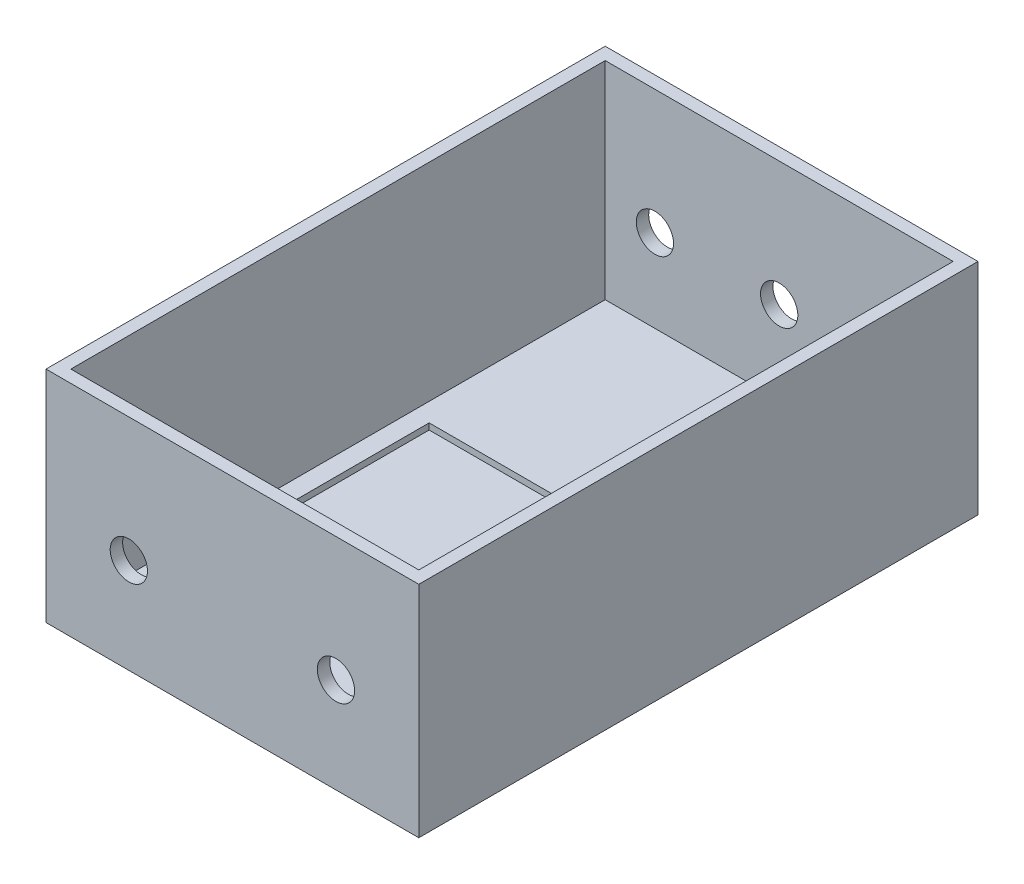
ISO-10303-21;
HEADER;
FILE_DESCRIPTION(('STEP AP214'),'2;1');
FILE_NAME('part.step','',(''),(''),'','','');
FILE_SCHEMA(('AUTOMOTIVE_DESIGN { 1 0 10303 214 1 1 1 1 }'));
ENDSEC;
DATA;
#1=APPLICATION_CONTEXT('core data for automotive mechanical design processes');
#2=APPLICATION_PROTOCOL_DEFINITION('international standard','automotive_design',2000,#1);
#3=PRODUCT_CONTEXT('',#1,'mechanical');
#4=PRODUCT('Part','Part','',(#3));
#5=PRODUCT_RELATED_PRODUCT_CATEGORY('part','',(#4));
#6=PRODUCT_DEFINITION_FORMATION('','',#4);
#7=PRODUCT_DEFINITION_CONTEXT('part definition',#1,'design');
#8=PRODUCT_DEFINITION('design','',#6,#7);
#9=PRODUCT_DEFINITION_SHAPE('','',#8);
#10=(LENGTH_UNIT() NAMED_UNIT(*) SI_UNIT(.MILLI.,.METRE.));
#11=(NAMED_UNIT(*) PLANE_ANGLE_UNIT() SI_UNIT($,.RADIAN.));
#12=(NAMED_UNIT(*) SI_UNIT($,.STERADIAN.) SOLID_ANGLE_UNIT());
#13=UNCERTAINTY_MEASURE_WITH_UNIT(LENGTH_MEASURE(1.E-05),#10,'distance_accuracy_value','');
#14=(GEOMETRIC_REPRESENTATION_CONTEXT(3) GLOBAL_UNCERTAINTY_ASSIGNED_CONTEXT((#13)) GLOBAL_UNIT_ASSIGNED_CONTEXT((#10,
#11,#12)) REPRESENTATION_CONTEXT('',''));
#15=CARTESIAN_POINT('',(0.,0.,0.));
#16=DIRECTION('',(0.,0.,1.));
#17=DIRECTION('',(1.,0.,0.));
#18=AXIS2_PLACEMENT_3D('',#15,#16,#17);
#19=CARTESIAN_POINT('',(0.,3.,0.));
#20=DIRECTION('',(0.,-1.,0.));
#21=DIRECTION('',(0.,0.,-1.));
#22=AXIS2_PLACEMENT_3D('',#19,#20,#21);
#23=PLANE('',#22);
#24=DIRECTION('',(0.,0.,-1.));
#25=VECTOR('',#24,1.);
#26=CARTESIAN_POINT('',(42.,3.,64.5));
#27=LINE('',#26,#25);
#28=CARTESIAN_POINT('',(42.,3.,64.5));
#29=VERTEX_POINT('',#28);
#30=CARTESIAN_POINT('',(42.,3.,-64.5));
#31=VERTEX_POINT('',#30);
#32=EDGE_CURVE('E144',#29,#31,#27,.T.);
#33=ORIENTED_EDGE('',*,*,#32,.T.);
#34=DIRECTION('',(-1.,0.,0.));
#35=VECTOR('',#34,1.);
#36=CARTESIAN_POINT('',(42.,3.,-64.5));
#37=LINE('',#36,#35);
#38=CARTESIAN_POINT('',(-42.,3.,-64.5));
#39=VERTEX_POINT('',#38);
#40=EDGE_CURVE('E168',#31,#39,#37,.T.);
#41=ORIENTED_EDGE('',*,*,#40,.T.);
#42=DIRECTION('',(0.,0.,1.));
#43=VECTOR('',#42,1.);
#44=CARTESIAN_POINT('',(-42.,3.,-64.5));
#45=LINE('',#44,#43);
#46=CARTESIAN_POINT('',(-42.,3.,64.5));
#47=VERTEX_POINT('',#46);
#48=EDGE_CURVE('E150',#39,#47,#45,.T.);
#49=ORIENTED_EDGE('',*,*,#48,.T.);
#50=DIRECTION('',(1.,0.,0.));
#51=VECTOR('',#50,1.);
#52=CARTESIAN_POINT('',(-42.,3.,64.5));
#53=LINE('',#52,#51);
#54=EDGE_CURVE('E174',#47,#29,#53,.T.);
#55=ORIENTED_EDGE('',*,*,#54,.T.);
#56=EDGE_LOOP('',(#33,#41,#49,#55));
#57=FACE_BOUND('',#56,.T.);
#58=DIRECTION('',(-1.,0.,0.));
#59=VECTOR('',#58,1.);
#60=CARTESIAN_POINT('',(-37.5,3.,-17.5));
#61=LINE('',#60,#59);
#62=CARTESIAN_POINT('',(37.5,3.,-17.5));
#63=VERTEX_POINT('',#62);
#64=CARTESIAN_POINT('',(-37.5,3.,-17.5));
#65=VERTEX_POINT('',#64);
#66=EDGE_CURVE('E223',#63,#65,#61,.T.);
#67=ORIENTED_EDGE('',*,*,#66,.F.);
#68=DIRECTION('',(0.,0.,-1.));
#69=VECTOR('',#68,1.);
#70=CARTESIAN_POINT('',(37.5,3.,17.5));
#71=LINE('',#70,#69);
#72=CARTESIAN_POINT('',(37.5,3.,17.5));
#73=VERTEX_POINT('',#72);
#74=EDGE_CURVE('E67',#73,#63,#71,.T.);
#75=ORIENTED_EDGE('',*,*,#74,.F.);
#76=DIRECTION('',(1.,0.,0.));
#77=VECTOR('',#76,1.);
#78=CARTESIAN_POINT('',(-37.5,3.,17.5));
#79=LINE('',#78,#77);
#80=CARTESIAN_POINT('',(-37.5,3.,17.5));
#81=VERTEX_POINT('',#80);
#82=EDGE_CURVE('E208',#81,#73,#79,.T.);
#83=ORIENTED_EDGE('',*,*,#82,.F.);
#84=DIRECTION('',(0.,0.,1.));
#85=VECTOR('',#84,1.);
#86=CARTESIAN_POINT('',(-37.5,3.,17.5));
#87=LINE('',#86,#85);
#88=EDGE_CURVE('E227',#65,#81,#87,.T.);
#89=ORIENTED_EDGE('',*,*,#88,.F.);
#90=EDGE_LOOP('',(#67,#75,#83,#89));
#91=FACE_BOUND('',#90,.T.);
#92=ADVANCED_FACE('F43',(#57,#91),#23,.F.);
#93=CARTESIAN_POINT('',(37.5,1.5,17.5));
#94=DIRECTION('',(1.,0.,0.));
#95=DIRECTION('',(0.,0.,-1.));
#96=AXIS2_PLACEMENT_3D('',#93,#94,#95);
#97=PLANE('',#96);
#98=ORIENTED_EDGE('',*,*,#74,.T.);
#99=DIRECTION('',(0.,1.,0.));
#100=VECTOR('',#99,1.);
#101=CARTESIAN_POINT('',(37.5,1.5,-17.5));
#102=LINE('',#101,#100);
#103=CARTESIAN_POINT('',(37.5,1.5,-17.5));
#104=VERTEX_POINT('',#103);
#105=EDGE_CURVE('E220',#104,#63,#102,.T.);
#106=ORIENTED_EDGE('',*,*,#105,.F.);
#107=DIRECTION('',(0.,0.,-1.));
#108=VECTOR('',#107,1.);
#109=CARTESIAN_POINT('',(37.5,1.5,17.5));
#110=LINE('',#109,#108);
#111=CARTESIAN_POINT('',(37.5,1.5,17.5));
#112=VERTEX_POINT('',#111);
#113=EDGE_CURVE('E203',#112,#104,#110,.T.);
#114=ORIENTED_EDGE('',*,*,#113,.F.);
#115=DIRECTION('',(0.,1.,0.));
#116=VECTOR('',#115,1.);
#117=CARTESIAN_POINT('',(37.5,1.5,17.5));
#118=LINE('',#117,#116);
#119=EDGE_CURVE('E234',#112,#73,#118,.T.);
#120=ORIENTED_EDGE('',*,*,#119,.T.);
#121=EDGE_LOOP('',(#98,#106,#114,#120));
#122=FACE_BOUND('',#121,.T.);
#123=ADVANCED_FACE('F298',(#122),#97,.F.);
#124=CARTESIAN_POINT('',(-37.5,1.5,17.5));
#125=DIRECTION('',(0.,0.,1.));
#126=DIRECTION('',(1.,0.,0.));
#127=AXIS2_PLACEMENT_3D('',#124,#125,#126);
#128=PLANE('',#127);
#129=ORIENTED_EDGE('',*,*,#82,.T.);
#130=ORIENTED_EDGE('',*,*,#119,.F.);
#131=DIRECTION('',(1.,0.,0.));
#132=VECTOR('',#131,1.);
#133=CARTESIAN_POINT('',(-37.5,1.5,17.5));
#134=LINE('',#133,#132);
#135=CARTESIAN_POINT('',(-37.5,1.5,17.5));
#136=VERTEX_POINT('',#135);
#137=EDGE_CURVE('E216',#136,#112,#134,.T.);
#138=ORIENTED_EDGE('',*,*,#137,.F.);
#139=DIRECTION('',(0.,1.,0.));
#140=VECTOR('',#139,1.);
#141=CARTESIAN_POINT('',(-37.5,1.5,17.5));
#142=LINE('',#141,#140);
#143=EDGE_CURVE('E238',#136,#81,#142,.T.);
#144=ORIENTED_EDGE('',*,*,#143,.T.);
#145=EDGE_LOOP('',(#129,#130,#138,#144));
#146=FACE_BOUND('',#145,.T.);
#147=ADVANCED_FACE('F306',(#146),#128,.F.);
#148=CARTESIAN_POINT('',(-37.5,1.5,17.5));
#149=DIRECTION('',(-1.,0.,0.));
#150=DIRECTION('',(0.,0.,1.));
#151=AXIS2_PLACEMENT_3D('',#148,#149,#150);
#152=PLANE('',#151);
#153=ORIENTED_EDGE('',*,*,#88,.T.);
#154=ORIENTED_EDGE('',*,*,#143,.F.);
#155=DIRECTION('',(0.,0.,1.));
#156=VECTOR('',#155,1.);
#157=CARTESIAN_POINT('',(-37.5,1.5,17.5));
#158=LINE('',#157,#156);
#159=CARTESIAN_POINT('',(-37.5,1.5,-17.5));
#160=VERTEX_POINT('',#159);
#161=EDGE_CURVE('E212',#160,#136,#158,.T.);
#162=ORIENTED_EDGE('',*,*,#161,.F.);
#163=DIRECTION('',(0.,1.,0.));
#164=VECTOR('',#163,1.);
#165=CARTESIAN_POINT('',(-37.5,1.5,-17.5));
#166=LINE('',#165,#164);
#167=EDGE_CURVE('E241',#160,#65,#166,.T.);
#168=ORIENTED_EDGE('',*,*,#167,.T.);
#169=EDGE_LOOP('',(#153,#154,#162,#168));
#170=FACE_BOUND('',#169,.T.);
#171=ADVANCED_FACE('F402',(#170),#152,.F.);
#172=CARTESIAN_POINT('',(-37.5,1.5,-17.5));
#173=DIRECTION('',(0.,0.,-1.));
#174=DIRECTION('',(-1.,0.,0.));
#175=AXIS2_PLACEMENT_3D('',#172,#173,#174);
#176=PLANE('',#175);
#177=ORIENTED_EDGE('',*,*,#66,.T.);
#178=ORIENTED_EDGE('',*,*,#167,.F.);
#179=DIRECTION('',(-1.,0.,0.));
#180=VECTOR('',#179,1.);
#181=CARTESIAN_POINT('',(-37.5,1.5,-17.5));
#182=LINE('',#181,#180);
#183=EDGE_CURVE('E207',#104,#160,#182,.T.);
#184=ORIENTED_EDGE('',*,*,#183,.F.);
#185=ORIENTED_EDGE('',*,*,#105,.T.);
#186=EDGE_LOOP('',(#177,#178,#184,#185));
#187=FACE_BOUND('',#186,.T.);
#188=ADVANCED_FACE('F398',(#187),#176,.F.);
#189=CARTESIAN_POINT('',(0.,1.5,0.));
#190=DIRECTION('',(0.,-1.,0.));
#191=DIRECTION('',(0.,0.,-1.));
#192=AXIS2_PLACEMENT_3D('',#189,#190,#191);
#193=PLANE('',#192);
#194=ORIENTED_EDGE('',*,*,#113,.T.);
#195=ORIENTED_EDGE('',*,*,#183,.T.);
#196=ORIENTED_EDGE('',*,*,#161,.T.);
#197=ORIENTED_EDGE('',*,*,#137,.T.);
#198=EDGE_LOOP('',(#194,#195,#196,#197));
#199=FACE_BOUND('',#198,.T.);
#200=ADVANCED_FACE('F395',(#199),#193,.F.);
#201=CARTESIAN_POINT('',(0.,53.,0.));
#202=DIRECTION('',(0.,1.,0.));
#203=DIRECTION('',(0.,0.,1.));
#204=AXIS2_PLACEMENT_3D('',#201,#202,#203);
#205=PLANE('',#204);
#206=DIRECTION('',(-1.,0.,0.));
#207=VECTOR('',#206,1.);
#208=CARTESIAN_POINT('',(45.,53.,-67.5));
#209=LINE('',#208,#207);
#210=CARTESIAN_POINT('',(45.,53.,-67.5));
#211=VERTEX_POINT('',#210);
#212=CARTESIAN_POINT('',(-45.,53.,-67.5));
#213=VERTEX_POINT('',#212);
#214=EDGE_CURVE('E152',#211,#213,#209,.T.);
#215=ORIENTED_EDGE('',*,*,#214,.T.);
#216=DIRECTION('',(0.,0.,1.));
#217=VECTOR('',#216,1.);
#218=CARTESIAN_POINT('',(-45.,53.,-67.5));
#219=LINE('',#218,#217);
#220=CARTESIAN_POINT('',(-45.,53.,67.5));
#221=VERTEX_POINT('',#220);
#222=EDGE_CURVE('E191',#213,#221,#219,.T.);
#223=ORIENTED_EDGE('',*,*,#222,.T.);
#224=DIRECTION('',(1.,0.,0.));
#225=VECTOR('',#224,1.);
#226=CARTESIAN_POINT('',(-45.,53.,67.5));
#227=LINE('',#226,#225);
#228=CARTESIAN_POINT('',(45.,53.,67.5));
#229=VERTEX_POINT('',#228);
#230=EDGE_CURVE('E195',#221,#229,#227,.T.);
#231=ORIENTED_EDGE('',*,*,#230,.T.);
#232=DIRECTION('',(0.,0.,-1.));
#233=VECTOR('',#232,1.);
#234=CARTESIAN_POINT('',(45.,53.,67.5));
#235=LINE('',#234,#233);
#236=EDGE_CURVE('E199',#229,#211,#235,.T.);
#237=ORIENTED_EDGE('',*,*,#236,.T.);
#238=EDGE_LOOP('',(#215,#223,#231,#237));
#239=FACE_BOUND('',#238,.T.);
#240=DIRECTION('',(0.,0.,1.));
#241=VECTOR('',#240,1.);
#242=CARTESIAN_POINT('',(-42.,53.,-64.5));
#243=LINE('',#242,#241);
#244=CARTESIAN_POINT('',(-42.,53.,-64.5));
#245=VERTEX_POINT('',#244);
#246=CARTESIAN_POINT('',(-42.,53.,64.5));
#247=VERTEX_POINT('',#246);
#248=EDGE_CURVE('E143',#245,#247,#243,.T.);
#249=ORIENTED_EDGE('',*,*,#248,.F.);
#250=DIRECTION('',(-1.,0.,0.));
#251=VECTOR('',#250,1.);
#252=CARTESIAN_POINT('',(42.,53.,-64.5));
#253=LINE('',#252,#251);
#254=CARTESIAN_POINT('',(42.,53.,-64.5));
#255=VERTEX_POINT('',#254);
#256=EDGE_CURVE('E134',#255,#245,#253,.T.);
#257=ORIENTED_EDGE('',*,*,#256,.F.);
#258=DIRECTION('',(0.,0.,-1.));
#259=VECTOR('',#258,1.);
#260=CARTESIAN_POINT('',(42.,53.,64.5));
#261=LINE('',#260,#259);
#262=CARTESIAN_POINT('',(42.,53.,64.5));
#263=VERTEX_POINT('',#262);
#264=EDGE_CURVE('E162',#263,#255,#261,.T.);
#265=ORIENTED_EDGE('',*,*,#264,.F.);
#266=DIRECTION('',(1.,0.,0.));
#267=VECTOR('',#266,1.);
#268=CARTESIAN_POINT('',(-42.,53.,64.5));
#269=LINE('',#268,#267);
#270=EDGE_CURVE('E158',#247,#263,#269,.T.);
#271=ORIENTED_EDGE('',*,*,#270,.F.);
#272=EDGE_LOOP('',(#249,#257,#265,#271));
#273=FACE_BOUND('',#272,.T.);
#274=ADVANCED_FACE('F156',(#239,#273),#205,.T.);
#275=CARTESIAN_POINT('',(42.,53.,-64.5));
#276=DIRECTION('',(0.,0.,1.));
#277=DIRECTION('',(1.,0.,0.));
#278=AXIS2_PLACEMENT_3D('',#275,#276,#277);
#279=PLANE('',#278);
#280=CARTESIAN_POINT('',(30.,23.,-64.5));
#281=DIRECTION('',(0.,0.,-1.));
#282=DIRECTION('',(-1.,0.,0.));
#283=AXIS2_PLACEMENT_3D('',#280,#281,#282);
#284=CIRCLE('',#283,4.5);
#285=CARTESIAN_POINT('',(25.5,23.,-64.5));
#286=VERTEX_POINT('',#285);
#287=EDGE_CURVE('E334',#286,#286,#284,.T.);
#288=ORIENTED_EDGE('',*,*,#287,.T.);
#289=EDGE_LOOP('',(#288));
#290=FACE_BOUND('',#289,.T.);
#291=CARTESIAN_POINT('',(0.,23.,-64.5));
#292=DIRECTION('',(0.,0.,-1.));
#293=DIRECTION('',(-1.,0.,0.));
#294=AXIS2_PLACEMENT_3D('',#291,#292,#293);
#295=CIRCLE('',#294,4.5);
#296=CARTESIAN_POINT('',(-4.5,23.,-64.5));
#297=VERTEX_POINT('',#296);
#298=EDGE_CURVE('E347',#297,#297,#295,.T.);
#299=ORIENTED_EDGE('',*,*,#298,.T.);
#300=EDGE_LOOP('',(#299));
#301=FACE_BOUND('',#300,.T.);
#302=CARTESIAN_POINT('',(-30.,23.,-64.5));
#303=DIRECTION('',(0.,0.,-1.));
#304=DIRECTION('',(-1.,0.,0.));
#305=AXIS2_PLACEMENT_3D('',#302,#303,#304);
#306=CIRCLE('',#305,4.5);
#307=CARTESIAN_POINT('',(-34.5,23.,-64.5));
#308=VERTEX_POINT('',#307);
#309=EDGE_CURVE('E339',#308,#308,#306,.T.);
#310=ORIENTED_EDGE('',*,*,#309,.T.);
#311=EDGE_LOOP('',(#310));
#312=FACE_BOUND('',#311,.T.);
#313=ORIENTED_EDGE('',*,*,#40,.F.);
#314=DIRECTION('',(0.,-1.,0.));
#315=VECTOR('',#314,1.);
#316=CARTESIAN_POINT('',(42.,53.,-64.5));
#317=LINE('',#316,#315);
#318=EDGE_CURVE('E59',#255,#31,#317,.T.);
#319=ORIENTED_EDGE('',*,*,#318,.F.);
#320=ORIENTED_EDGE('',*,*,#256,.T.);
#321=DIRECTION('',(0.,-1.,0.));
#322=VECTOR('',#321,1.);
#323=CARTESIAN_POINT('',(-42.,53.,-64.5));
#324=LINE('',#323,#322);
#325=EDGE_CURVE('E137',#245,#39,#324,.T.);
#326=ORIENTED_EDGE('',*,*,#325,.T.);
#327=EDGE_LOOP('',(#313,#319,#320,#326));
#328=FACE_BOUND('',#327,.T.);
#329=ADVANCED_FACE('F136',(#290,#301,#312,#328),#279,.T.);
#330=CARTESIAN_POINT('',(-42.,53.,-64.5));
#331=DIRECTION('',(1.,0.,0.));
#332=DIRECTION('',(0.,0.,-1.));
#333=AXIS2_PLACEMENT_3D('',#330,#331,#332);
#334=PLANE('',#333);
#335=ORIENTED_EDGE('',*,*,#48,.F.);
#336=ORIENTED_EDGE('',*,*,#325,.F.);
#337=ORIENTED_EDGE('',*,*,#248,.T.);
#338=DIRECTION('',(0.,-1.,0.));
#339=VECTOR('',#338,1.);
#340=CARTESIAN_POINT('',(-42.,53.,64.5));
#341=LINE('',#340,#339);
#342=EDGE_CURVE('E153',#247,#47,#341,.T.);
#343=ORIENTED_EDGE('',*,*,#342,.T.);
#344=EDGE_LOOP('',(#335,#336,#337,#343));
#345=FACE_BOUND('',#344,.T.);
#346=ADVANCED_FACE('F147',(#345),#334,.T.);
#347=CARTESIAN_POINT('',(-42.,53.,64.5));
#348=DIRECTION('',(0.,0.,-1.));
#349=DIRECTION('',(-1.,0.,0.));
#350=AXIS2_PLACEMENT_3D('',#347,#348,#349);
#351=PLANE('',#350);
#352=CARTESIAN_POINT('',(-25.,23.,64.5));
#353=DIRECTION('',(0.,0.,1.));
#354=DIRECTION('',(1.,0.,0.));
#355=AXIS2_PLACEMENT_3D('',#352,#353,#354);
#356=CIRCLE('',#355,4.5);
#357=CARTESIAN_POINT('',(-20.5,23.,64.5));
#358=VERTEX_POINT('',#357);
#359=EDGE_CURVE('E171',#358,#358,#356,.T.);
#360=ORIENTED_EDGE('',*,*,#359,.T.);
#361=EDGE_LOOP('',(#360));
#362=FACE_BOUND('',#361,.T.);
#363=CARTESIAN_POINT('',(25.,23.,64.5));
#364=DIRECTION('',(0.,0.,1.));
#365=DIRECTION('',(1.,0.,0.));
#366=AXIS2_PLACEMENT_3D('',#363,#364,#365);
#367=CIRCLE('',#366,4.5);
#368=CARTESIAN_POINT('',(29.5,23.,64.5));
#369=VERTEX_POINT('',#368);
#370=EDGE_CURVE('E328',#369,#369,#367,.T.);
#371=ORIENTED_EDGE('',*,*,#370,.T.);
#372=EDGE_LOOP('',(#371));
#373=FACE_BOUND('',#372,.T.);
#374=ORIENTED_EDGE('',*,*,#54,.F.);
#375=ORIENTED_EDGE('',*,*,#342,.F.);
#376=ORIENTED_EDGE('',*,*,#270,.T.);
#377=DIRECTION('',(0.,-1.,0.));
#378=VECTOR('',#377,1.);
#379=CARTESIAN_POINT('',(42.,53.,64.5));
#380=LINE('',#379,#378);
#381=EDGE_CURVE('E183',#263,#29,#380,.T.);
#382=ORIENTED_EDGE('',*,*,#381,.T.);
#383=EDGE_LOOP('',(#374,#375,#376,#382));
#384=FACE_BOUND('',#383,.T.);
#385=ADVANCED_FACE('F385',(#362,#373,#384),#351,.T.);
#386=CARTESIAN_POINT('',(42.,53.,64.5));
#387=DIRECTION('',(-1.,0.,0.));
#388=DIRECTION('',(0.,0.,1.));
#389=AXIS2_PLACEMENT_3D('',#386,#387,#388);
#390=PLANE('',#389);
#391=ORIENTED_EDGE('',*,*,#32,.F.);
#392=ORIENTED_EDGE('',*,*,#381,.F.);
#393=ORIENTED_EDGE('',*,*,#264,.T.);
#394=ORIENTED_EDGE('',*,*,#318,.T.);
#395=EDGE_LOOP('',(#391,#392,#393,#394));
#396=FACE_BOUND('',#395,.T.);
#397=ADVANCED_FACE('F313',(#396),#390,.T.);
#398=CARTESIAN_POINT('',(0.,0.,0.));
#399=DIRECTION('',(0.,-1.,0.));
#400=DIRECTION('',(0.,0.,-1.));
#401=AXIS2_PLACEMENT_3D('',#398,#399,#400);
#402=PLANE('',#401);
#403=DIRECTION('',(0.,0.,-1.));
#404=VECTOR('',#403,1.);
#405=CARTESIAN_POINT('',(45.,0.,67.5));
#406=LINE('',#405,#404);
#407=CARTESIAN_POINT('',(45.,0.,67.5));
#408=VERTEX_POINT('',#407);
#409=CARTESIAN_POINT('',(45.,0.,-67.5));
#410=VERTEX_POINT('',#409);
#411=EDGE_CURVE('E237',#408,#410,#406,.T.);
#412=ORIENTED_EDGE('',*,*,#411,.F.);
#413=DIRECTION('',(1.,0.,0.));
#414=VECTOR('',#413,1.);
#415=CARTESIAN_POINT('',(-45.,0.,67.5));
#416=LINE('',#415,#414);
#417=CARTESIAN_POINT('',(-45.,0.,67.5));
#418=VERTEX_POINT('',#417);
#419=EDGE_CURVE('E255',#418,#408,#416,.T.);
#420=ORIENTED_EDGE('',*,*,#419,.F.);
#421=DIRECTION('',(0.,0.,1.));
#422=VECTOR('',#421,1.);
#423=CARTESIAN_POINT('',(-45.,0.,67.5));
#424=LINE('',#423,#422);
#425=CARTESIAN_POINT('',(-45.,0.,-67.5));
#426=VERTEX_POINT('',#425);
#427=EDGE_CURVE('E252',#426,#418,#424,.T.);
#428=ORIENTED_EDGE('',*,*,#427,.F.);
#429=DIRECTION('',(-1.,0.,0.));
#430=VECTOR('',#429,1.);
#431=CARTESIAN_POINT('',(-45.,0.,-67.5));
#432=LINE('',#431,#430);
#433=EDGE_CURVE('E249',#410,#426,#432,.T.);
#434=ORIENTED_EDGE('',*,*,#433,.F.);
#435=EDGE_LOOP('',(#412,#420,#428,#434));
#436=FACE_BOUND('',#435,.T.);
#437=ADVANCED_FACE('F276',(#436),#402,.T.);
#438=CARTESIAN_POINT('',(45.,3.,67.5));
#439=DIRECTION('',(-1.,0.,0.));
#440=DIRECTION('',(0.,0.,1.));
#441=AXIS2_PLACEMENT_3D('',#438,#439,#440);
#442=PLANE('',#441);
#443=ORIENTED_EDGE('',*,*,#411,.T.);
#444=DIRECTION('',(0.,-1.,0.));
#445=VECTOR('',#444,1.);
#446=CARTESIAN_POINT('',(45.,3.,-67.5));
#447=LINE('',#446,#445);
#448=EDGE_CURVE('E11',#211,#410,#447,.T.);
#449=ORIENTED_EDGE('',*,*,#448,.F.);
#450=ORIENTED_EDGE('',*,*,#236,.F.);
#451=DIRECTION('',(0.,-1.,0.));
#452=VECTOR('',#451,1.);
#453=CARTESIAN_POINT('',(45.,3.,67.5));
#454=LINE('',#453,#452);
#455=EDGE_CURVE('E258',#229,#408,#454,.T.);
#456=ORIENTED_EDGE('',*,*,#455,.T.);
#457=EDGE_LOOP('',(#443,#449,#450,#456));
#458=FACE_BOUND('',#457,.T.);
#459=ADVANCED_FACE('F45',(#458),#442,.F.);
#460=CARTESIAN_POINT('',(-45.,3.,67.5));
#461=DIRECTION('',(0.,0.,-1.));
#462=DIRECTION('',(-1.,0.,0.));
#463=AXIS2_PLACEMENT_3D('',#460,#461,#462);
#464=PLANE('',#463);
#465=CARTESIAN_POINT('',(-25.,23.,67.5));
#466=DIRECTION('',(0.,0.,1.));
#467=DIRECTION('',(1.,0.,0.));
#468=AXIS2_PLACEMENT_3D('',#465,#466,#467);
#469=CIRCLE('',#468,4.5);
#470=CARTESIAN_POINT('',(-20.5,23.,67.5));
#471=VERTEX_POINT('',#470);
#472=EDGE_CURVE('E322',#471,#471,#469,.T.);
#473=ORIENTED_EDGE('',*,*,#472,.F.);
#474=EDGE_LOOP('',(#473));
#475=FACE_BOUND('',#474,.T.);
#476=CARTESIAN_POINT('',(25.,23.,67.5));
#477=DIRECTION('',(0.,0.,1.));
#478=DIRECTION('',(1.,0.,0.));
#479=AXIS2_PLACEMENT_3D('',#476,#477,#478);
#480=CIRCLE('',#479,4.5);
#481=CARTESIAN_POINT('',(29.5,23.,67.5));
#482=VERTEX_POINT('',#481);
#483=EDGE_CURVE('E325',#482,#482,#480,.T.);
#484=ORIENTED_EDGE('',*,*,#483,.F.);
#485=EDGE_LOOP('',(#484));
#486=FACE_BOUND('',#485,.T.);
#487=ORIENTED_EDGE('',*,*,#419,.T.);
#488=ORIENTED_EDGE('',*,*,#455,.F.);
#489=ORIENTED_EDGE('',*,*,#230,.F.);
#490=DIRECTION('',(0.,-1.,0.));
#491=VECTOR('',#490,1.);
#492=CARTESIAN_POINT('',(-45.,3.,67.5));
#493=LINE('',#492,#491);
#494=EDGE_CURVE('E262',#221,#418,#493,.T.);
#495=ORIENTED_EDGE('',*,*,#494,.T.);
#496=EDGE_LOOP('',(#487,#488,#489,#495));
#497=FACE_BOUND('',#496,.T.);
#498=ADVANCED_FACE('F278',(#475,#486,#497),#464,.F.);
#499=CARTESIAN_POINT('',(-45.,3.,67.5));
#500=DIRECTION('',(1.,0.,0.));
#501=DIRECTION('',(0.,0.,-1.));
#502=AXIS2_PLACEMENT_3D('',#499,#500,#501);
#503=PLANE('',#502);
#504=ORIENTED_EDGE('',*,*,#427,.T.);
#505=ORIENTED_EDGE('',*,*,#494,.F.);
#506=ORIENTED_EDGE('',*,*,#222,.F.);
#507=DIRECTION('',(0.,-1.,0.));
#508=VECTOR('',#507,1.);
#509=CARTESIAN_POINT('',(-45.,3.,-67.5));
#510=LINE('',#509,#508);
#511=EDGE_CURVE('E52',#213,#426,#510,.T.);
#512=ORIENTED_EDGE('',*,*,#511,.T.);
#513=EDGE_LOOP('',(#504,#505,#506,#512));
#514=FACE_BOUND('',#513,.T.);
#515=ADVANCED_FACE('F270',(#514),#503,.F.);
#516=CARTESIAN_POINT('',(-45.,3.,-67.5));
#517=DIRECTION('',(0.,0.,1.));
#518=DIRECTION('',(1.,0.,0.));
#519=AXIS2_PLACEMENT_3D('',#516,#517,#518);
#520=PLANE('',#519);
#521=CARTESIAN_POINT('',(30.,23.,-67.5));
#522=DIRECTION('',(0.,0.,-1.));
#523=DIRECTION('',(-1.,0.,0.));
#524=AXIS2_PLACEMENT_3D('',#521,#522,#523);
#525=CIRCLE('',#524,4.5);
#526=CARTESIAN_POINT('',(25.5,23.,-67.5));
#527=VERTEX_POINT('',#526);
#528=EDGE_CURVE('E355',#527,#527,#525,.T.);
#529=ORIENTED_EDGE('',*,*,#528,.F.);
#530=EDGE_LOOP('',(#529));
#531=FACE_BOUND('',#530,.T.);
#532=CARTESIAN_POINT('',(0.,23.,-67.5));
#533=DIRECTION('',(0.,0.,-1.));
#534=DIRECTION('',(-1.,0.,0.));
#535=AXIS2_PLACEMENT_3D('',#532,#533,#534);
#536=CIRCLE('',#535,4.5);
#537=CARTESIAN_POINT('',(-4.5,23.,-67.5));
#538=VERTEX_POINT('',#537);
#539=EDGE_CURVE('E351',#538,#538,#536,.T.);
#540=ORIENTED_EDGE('',*,*,#539,.F.);
#541=EDGE_LOOP('',(#540));
#542=FACE_BOUND('',#541,.T.);
#543=CARTESIAN_POINT('',(-30.,23.,-67.5));
#544=DIRECTION('',(0.,0.,-1.));
#545=DIRECTION('',(-1.,0.,0.));
#546=AXIS2_PLACEMENT_3D('',#543,#544,#545);
#547=CIRCLE('',#546,4.5);
#548=CARTESIAN_POINT('',(-34.5,23.,-67.5));
#549=VERTEX_POINT('',#548);
#550=EDGE_CURVE('E343',#549,#549,#547,.T.);
#551=ORIENTED_EDGE('',*,*,#550,.F.);
#552=EDGE_LOOP('',(#551));
#553=FACE_BOUND('',#552,.T.);
#554=ORIENTED_EDGE('',*,*,#433,.T.);
#555=ORIENTED_EDGE('',*,*,#511,.F.);
#556=ORIENTED_EDGE('',*,*,#214,.F.);
#557=ORIENTED_EDGE('',*,*,#448,.T.);
#558=EDGE_LOOP('',(#554,#555,#556,#557));
#559=FACE_BOUND('',#558,.T.);
#560=ADVANCED_FACE('F283',(#531,#542,#553,#559),#520,.F.);
#561=CARTESIAN_POINT('',(25.,23.,64.5));
#562=DIRECTION('',(0.,0.,1.));
#563=DIRECTION('',(1.,0.,0.));
#564=AXIS2_PLACEMENT_3D('',#561,#562,#563);
#565=CYLINDRICAL_SURFACE('',#564,4.5);
#566=ORIENTED_EDGE('',*,*,#370,.F.);
#567=EDGE_LOOP('',(#566));
#568=FACE_BOUND('',#567,.T.);
#569=ORIENTED_EDGE('',*,*,#483,.T.);
#570=EDGE_LOOP('',(#569));
#571=FACE_BOUND('',#570,.T.);
#572=ADVANCED_FACE('F285',(#568,#571),#565,.F.);
#573=CARTESIAN_POINT('',(-25.,23.,64.5));
#574=DIRECTION('',(0.,0.,1.));
#575=DIRECTION('',(1.,0.,0.));
#576=AXIS2_PLACEMENT_3D('',#573,#574,#575);
#577=CYLINDRICAL_SURFACE('',#576,4.5);
#578=ORIENTED_EDGE('',*,*,#359,.F.);
#579=EDGE_LOOP('',(#578));
#580=FACE_BOUND('',#579,.T.);
#581=ORIENTED_EDGE('',*,*,#472,.T.);
#582=EDGE_LOOP('',(#581));
#583=FACE_BOUND('',#582,.T.);
#584=ADVANCED_FACE('F291',(#580,#583),#577,.F.);
#585=CARTESIAN_POINT('',(-30.,23.,-64.5));
#586=DIRECTION('',(0.,0.,-1.));
#587=DIRECTION('',(-1.,0.,0.));
#588=AXIS2_PLACEMENT_3D('',#585,#586,#587);
#589=CYLINDRICAL_SURFACE('',#588,4.5);
#590=ORIENTED_EDGE('',*,*,#309,.F.);
#591=EDGE_LOOP('',(#590));
#592=FACE_BOUND('',#591,.T.);
#593=ORIENTED_EDGE('',*,*,#550,.T.);
#594=EDGE_LOOP('',(#593));
#595=FACE_BOUND('',#594,.T.);
#596=ADVANCED_FACE('F373',(#592,#595),#589,.F.);
#597=CARTESIAN_POINT('',(0.,23.,-64.5));
#598=DIRECTION('',(0.,0.,-1.));
#599=DIRECTION('',(-1.,0.,0.));
#600=AXIS2_PLACEMENT_3D('',#597,#598,#599);
#601=CYLINDRICAL_SURFACE('',#600,4.5);
#602=ORIENTED_EDGE('',*,*,#298,.F.);
#603=EDGE_LOOP('',(#602));
#604=FACE_BOUND('',#603,.T.);
#605=ORIENTED_EDGE('',*,*,#539,.T.);
#606=EDGE_LOOP('',(#605));
#607=FACE_BOUND('',#606,.T.);
#608=ADVANCED_FACE('F368',(#604,#607),#601,.F.);
#609=CARTESIAN_POINT('',(30.,23.,-64.5));
#610=DIRECTION('',(0.,0.,-1.));
#611=DIRECTION('',(-1.,0.,0.));
#612=AXIS2_PLACEMENT_3D('',#609,#610,#611);
#613=CYLINDRICAL_SURFACE('',#612,4.5);
#614=ORIENTED_EDGE('',*,*,#287,.F.);
#615=EDGE_LOOP('',(#614));
#616=FACE_BOUND('',#615,.T.);
#617=ORIENTED_EDGE('',*,*,#528,.T.);
#618=EDGE_LOOP('',(#617));
#619=FACE_BOUND('',#618,.T.);
#620=ADVANCED_FACE('F365',(#616,#619),#613,.F.);
#621=CLOSED_SHELL('',(#92,#123,#147,#171,#188,#200,#274,#329,#346,#385,#397,#437,#459,#498,#515,
#560,#572,#584,#596,#608,#620));
#622=MANIFOLD_SOLID_BREP('B2',#621);
#623=ADVANCED_BREP_SHAPE_REPRESENTATION('',(#18,#622),#14);
#624=SHAPE_DEFINITION_REPRESENTATION(#9,#623);
ENDSEC;
END-ISO-10303-21;
